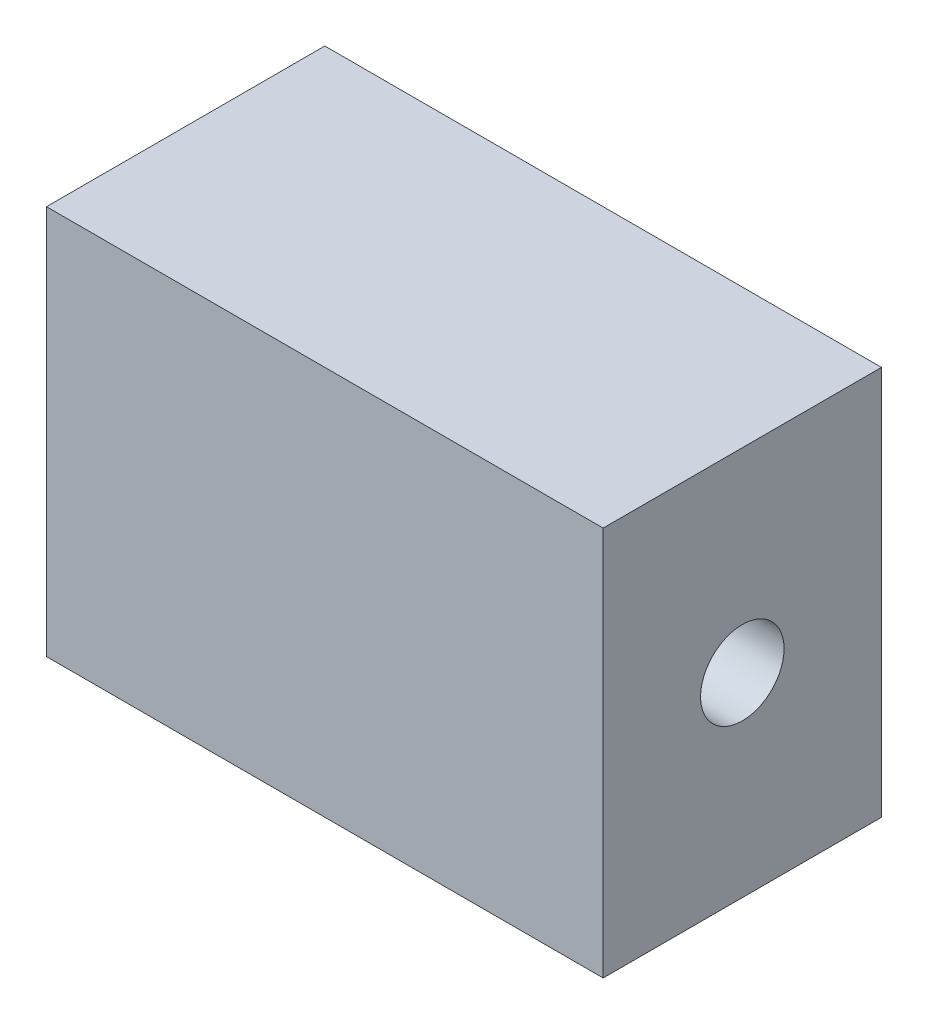
ISO-10303-21;
HEADER;
FILE_DESCRIPTION(('STEP AP214'),'2;1');
FILE_NAME('part.step','',(''),(''),'','','');
FILE_SCHEMA(('AUTOMOTIVE_DESIGN { 1 0 10303 214 1 1 1 1 }'));
ENDSEC;
DATA;
#1=APPLICATION_CONTEXT('core data for automotive mechanical design processes');
#2=APPLICATION_PROTOCOL_DEFINITION('international standard','automotive_design',2000,#1);
#3=PRODUCT_CONTEXT('',#1,'mechanical');
#4=PRODUCT('Part','Part','',(#3));
#5=PRODUCT_RELATED_PRODUCT_CATEGORY('part','',(#4));
#6=PRODUCT_DEFINITION_FORMATION('','',#4);
#7=PRODUCT_DEFINITION_CONTEXT('part definition',#1,'design');
#8=PRODUCT_DEFINITION('design','',#6,#7);
#9=PRODUCT_DEFINITION_SHAPE('','',#8);
#10=(LENGTH_UNIT() NAMED_UNIT(*) SI_UNIT(.MILLI.,.METRE.));
#11=(NAMED_UNIT(*) PLANE_ANGLE_UNIT() SI_UNIT($,.RADIAN.));
#12=(NAMED_UNIT(*) SI_UNIT($,.STERADIAN.) SOLID_ANGLE_UNIT());
#13=UNCERTAINTY_MEASURE_WITH_UNIT(LENGTH_MEASURE(1.E-05),#10,'distance_accuracy_value','');
#14=(GEOMETRIC_REPRESENTATION_CONTEXT(3) GLOBAL_UNCERTAINTY_ASSIGNED_CONTEXT((#13)) GLOBAL_UNIT_ASSIGNED_CONTEXT((#10,
#11,#12)) REPRESENTATION_CONTEXT('',''));
#15=CARTESIAN_POINT('',(0.,0.,0.));
#16=DIRECTION('',(0.,0.,1.));
#17=DIRECTION('',(1.,0.,0.));
#18=AXIS2_PLACEMENT_3D('',#15,#16,#17);
#19=CARTESIAN_POINT('',(100.,0.,50.));
#20=DIRECTION('',(0.,1.,0.));
#21=DIRECTION('',(0.,0.,1.));
#22=AXIS2_PLACEMENT_3D('',#19,#20,#21);
#23=PLANE('',#22);
#24=DIRECTION('',(1.,0.,0.));
#25=VECTOR('',#24,1.);
#26=CARTESIAN_POINT('',(100.,0.,0.));
#27=LINE('',#26,#25);
#28=CARTESIAN_POINT('',(0.,0.,0.));
#29=VERTEX_POINT('',#28);
#30=CARTESIAN_POINT('',(100.,0.,0.));
#31=VERTEX_POINT('',#30);
#32=EDGE_CURVE('E168',#29,#31,#27,.T.);
#33=ORIENTED_EDGE('',*,*,#32,.T.);
#34=DIRECTION('',(0.,0.,-1.));
#35=VECTOR('',#34,1.);
#36=CARTESIAN_POINT('',(100.,0.,50.));
#37=LINE('',#36,#35);
#38=CARTESIAN_POINT('',(100.,0.,50.));
#39=VERTEX_POINT('',#38);
#40=EDGE_CURVE('E11',#39,#31,#37,.T.);
#41=ORIENTED_EDGE('',*,*,#40,.F.);
#42=DIRECTION('',(1.,0.,0.));
#43=VECTOR('',#42,1.);
#44=CARTESIAN_POINT('',(100.,0.,50.));
#45=LINE('',#44,#43);
#46=CARTESIAN_POINT('',(0.,0.,50.));
#47=VERTEX_POINT('',#46);
#48=EDGE_CURVE('E172',#47,#39,#45,.T.);
#49=ORIENTED_EDGE('',*,*,#48,.F.);
#50=DIRECTION('',(0.,0.,-1.));
#51=VECTOR('',#50,1.);
#52=CARTESIAN_POINT('',(0.,0.,50.));
#53=LINE('',#52,#51);
#54=EDGE_CURVE('E182',#47,#29,#53,.T.);
#55=ORIENTED_EDGE('',*,*,#54,.T.);
#56=EDGE_LOOP('',(#33,#41,#49,#55));
#57=FACE_BOUND('',#56,.T.);
#58=ADVANCED_FACE('F39',(#57),#23,.F.);
#59=CARTESIAN_POINT('',(100.,70.,50.));
#60=DIRECTION('',(-1.,0.,0.));
#61=DIRECTION('',(0.,0.,1.));
#62=AXIS2_PLACEMENT_3D('',#59,#60,#61);
#63=PLANE('',#62);
#64=CARTESIAN_POINT('',(100.,35.,25.));
#65=DIRECTION('',(1.,0.,0.));
#66=DIRECTION('',(0.,0.,-1.));
#67=AXIS2_PLACEMENT_3D('',#64,#65,#66);
#68=CIRCLE('',#67,7.5);
#69=CARTESIAN_POINT('',(100.,35.,17.5));
#70=VERTEX_POINT('',#69);
#71=EDGE_CURVE('E158',#70,#70,#68,.T.);
#72=ORIENTED_EDGE('',*,*,#71,.F.);
#73=EDGE_LOOP('',(#72));
#74=FACE_BOUND('',#73,.T.);
#75=DIRECTION('',(0.,1.,0.));
#76=VECTOR('',#75,1.);
#77=CARTESIAN_POINT('',(100.,70.,0.));
#78=LINE('',#77,#76);
#79=CARTESIAN_POINT('',(100.,70.,0.));
#80=VERTEX_POINT('',#79);
#81=EDGE_CURVE('E186',#31,#80,#78,.T.);
#82=ORIENTED_EDGE('',*,*,#81,.T.);
#83=DIRECTION('',(0.,0.,-1.));
#84=VECTOR('',#83,1.);
#85=CARTESIAN_POINT('',(100.,70.,50.));
#86=LINE('',#85,#84);
#87=CARTESIAN_POINT('',(100.,70.,50.));
#88=VERTEX_POINT('',#87);
#89=EDGE_CURVE('E47',#88,#80,#86,.T.);
#90=ORIENTED_EDGE('',*,*,#89,.F.);
#91=DIRECTION('',(0.,1.,0.));
#92=VECTOR('',#91,1.);
#93=CARTESIAN_POINT('',(100.,70.,50.));
#94=LINE('',#93,#92);
#95=EDGE_CURVE('E91',#39,#88,#94,.T.);
#96=ORIENTED_EDGE('',*,*,#95,.F.);
#97=ORIENTED_EDGE('',*,*,#40,.T.);
#98=EDGE_LOOP('',(#82,#90,#96,#97));
#99=FACE_BOUND('',#98,.T.);
#100=ADVANCED_FACE('F221',(#74,#99),#63,.F.);
#101=CARTESIAN_POINT('',(0.,70.,50.));
#102=DIRECTION('',(0.,-1.,0.));
#103=DIRECTION('',(0.,0.,-1.));
#104=AXIS2_PLACEMENT_3D('',#101,#102,#103);
#105=PLANE('',#104);
#106=DIRECTION('',(-1.,0.,0.));
#107=VECTOR('',#106,1.);
#108=CARTESIAN_POINT('',(0.,70.,0.));
#109=LINE('',#108,#107);
#110=CARTESIAN_POINT('',(0.,70.,0.));
#111=VERTEX_POINT('',#110);
#112=EDGE_CURVE('E189',#80,#111,#109,.T.);
#113=ORIENTED_EDGE('',*,*,#112,.T.);
#114=DIRECTION('',(0.,0.,-1.));
#115=VECTOR('',#114,1.);
#116=CARTESIAN_POINT('',(0.,70.,50.));
#117=LINE('',#116,#115);
#118=CARTESIAN_POINT('',(0.,70.,50.));
#119=VERTEX_POINT('',#118);
#120=EDGE_CURVE('E196',#119,#111,#117,.T.);
#121=ORIENTED_EDGE('',*,*,#120,.F.);
#122=DIRECTION('',(-1.,0.,0.));
#123=VECTOR('',#122,1.);
#124=CARTESIAN_POINT('',(0.,70.,50.));
#125=LINE('',#124,#123);
#126=EDGE_CURVE('E177',#88,#119,#125,.T.);
#127=ORIENTED_EDGE('',*,*,#126,.F.);
#128=ORIENTED_EDGE('',*,*,#89,.T.);
#129=EDGE_LOOP('',(#113,#121,#127,#128));
#130=FACE_BOUND('',#129,.T.);
#131=ADVANCED_FACE('F203',(#130),#105,.F.);
#132=CARTESIAN_POINT('',(0.,0.,50.));
#133=DIRECTION('',(1.,0.,0.));
#134=DIRECTION('',(0.,0.,-1.));
#135=AXIS2_PLACEMENT_3D('',#132,#133,#134);
#136=PLANE('',#135);
#137=CARTESIAN_POINT('',(0.,35.,25.));
#138=DIRECTION('',(1.,0.,0.));
#139=DIRECTION('',(0.,0.,-1.));
#140=AXIS2_PLACEMENT_3D('',#137,#138,#139);
#141=CIRCLE('',#140,7.5);
#142=CARTESIAN_POINT('',(0.,35.,17.5));
#143=VERTEX_POINT('',#142);
#144=EDGE_CURVE('E164',#143,#143,#141,.T.);
#145=ORIENTED_EDGE('',*,*,#144,.T.);
#146=EDGE_LOOP('',(#145));
#147=FACE_BOUND('',#146,.T.);
#148=DIRECTION('',(0.,-1.,0.));
#149=VECTOR('',#148,1.);
#150=CARTESIAN_POINT('',(0.,0.,0.));
#151=LINE('',#150,#149);
#152=EDGE_CURVE('E84',#111,#29,#151,.T.);
#153=ORIENTED_EDGE('',*,*,#152,.T.);
#154=ORIENTED_EDGE('',*,*,#54,.F.);
#155=DIRECTION('',(0.,-1.,0.));
#156=VECTOR('',#155,1.);
#157=CARTESIAN_POINT('',(0.,0.,50.));
#158=LINE('',#157,#156);
#159=EDGE_CURVE('E63',#119,#47,#158,.T.);
#160=ORIENTED_EDGE('',*,*,#159,.F.);
#161=ORIENTED_EDGE('',*,*,#120,.T.);
#162=EDGE_LOOP('',(#153,#154,#160,#161));
#163=FACE_BOUND('',#162,.T.);
#164=ADVANCED_FACE('F211',(#147,#163),#136,.F.);
#165=CARTESIAN_POINT('',(0.,0.,50.));
#166=DIRECTION('',(0.,0.,-1.));
#167=DIRECTION('',(-1.,0.,0.));
#168=AXIS2_PLACEMENT_3D('',#165,#166,#167);
#169=PLANE('',#168);
#170=ORIENTED_EDGE('',*,*,#48,.T.);
#171=ORIENTED_EDGE('',*,*,#95,.T.);
#172=ORIENTED_EDGE('',*,*,#126,.T.);
#173=ORIENTED_EDGE('',*,*,#159,.T.);
#174=EDGE_LOOP('',(#170,#171,#172,#173));
#175=FACE_BOUND('',#174,.T.);
#176=ADVANCED_FACE('F213',(#175),#169,.F.);
#177=CARTESIAN_POINT('',(0.,0.,0.));
#178=DIRECTION('',(0.,0.,-1.));
#179=DIRECTION('',(-1.,0.,0.));
#180=AXIS2_PLACEMENT_3D('',#177,#178,#179);
#181=PLANE('',#180);
#182=DIRECTION('',(1.,0.,0.));
#183=VECTOR('',#182,1.);
#184=CARTESIAN_POINT('',(10.,60.,0.));
#185=LINE('',#184,#183);
#186=CARTESIAN_POINT('',(10.,60.,0.));
#187=VERTEX_POINT('',#186);
#188=CARTESIAN_POINT('',(90.,60.,0.));
#189=VERTEX_POINT('',#188);
#190=EDGE_CURVE('E54',#187,#189,#185,.T.);
#191=ORIENTED_EDGE('',*,*,#190,.F.);
#192=DIRECTION('',(0.,1.,0.));
#193=VECTOR('',#192,1.);
#194=CARTESIAN_POINT('',(9.99999999999999,10.,0.));
#195=LINE('',#194,#193);
#196=CARTESIAN_POINT('',(9.99999999999999,10.,0.));
#197=VERTEX_POINT('',#196);
#198=EDGE_CURVE('E136',#197,#187,#195,.T.);
#199=ORIENTED_EDGE('',*,*,#198,.F.);
#200=DIRECTION('',(-1.,0.,0.));
#201=VECTOR('',#200,1.);
#202=CARTESIAN_POINT('',(90.,10.,0.));
#203=LINE('',#202,#201);
#204=CARTESIAN_POINT('',(90.,10.,0.));
#205=VERTEX_POINT('',#204);
#206=EDGE_CURVE('E140',#205,#197,#203,.T.);
#207=ORIENTED_EDGE('',*,*,#206,.F.);
#208=DIRECTION('',(0.,-1.,0.));
#209=VECTOR('',#208,1.);
#210=CARTESIAN_POINT('',(90.,60.,0.));
#211=LINE('',#210,#209);
#212=EDGE_CURVE('E149',#189,#205,#211,.T.);
#213=ORIENTED_EDGE('',*,*,#212,.F.);
#214=EDGE_LOOP('',(#191,#199,#207,#213));
#215=FACE_BOUND('',#214,.T.);
#216=ORIENTED_EDGE('',*,*,#32,.F.);
#217=ORIENTED_EDGE('',*,*,#152,.F.);
#218=ORIENTED_EDGE('',*,*,#112,.F.);
#219=ORIENTED_EDGE('',*,*,#81,.F.);
#220=EDGE_LOOP('',(#216,#217,#218,#219));
#221=FACE_BOUND('',#220,.T.);
#222=ADVANCED_FACE('F207',(#215,#221),#181,.T.);
#223=CARTESIAN_POINT('',(0.,35.,25.));
#224=DIRECTION('',(1.,0.,0.));
#225=DIRECTION('',(0.,0.,-1.));
#226=AXIS2_PLACEMENT_3D('',#223,#224,#225);
#227=CYLINDRICAL_SURFACE('',#226,7.5);
#228=ORIENTED_EDGE('',*,*,#144,.F.);
#229=EDGE_LOOP('',(#228));
#230=FACE_BOUND('',#229,.T.);
#231=ORIENTED_EDGE('',*,*,#71,.T.);
#232=EDGE_LOOP('',(#231));
#233=FACE_BOUND('',#232,.T.);
#234=ADVANCED_FACE('F233',(#230,#233),#227,.F.);
#235=CARTESIAN_POINT('',(10.,60.,10.));
#236=DIRECTION('',(0.,1.,0.));
#237=DIRECTION('',(-1.,0.,0.));
#238=AXIS2_PLACEMENT_3D('',#235,#236,#237);
#239=PLANE('',#238);
#240=ORIENTED_EDGE('',*,*,#190,.T.);
#241=DIRECTION('',(0.,0.,-1.));
#242=VECTOR('',#241,1.);
#243=CARTESIAN_POINT('',(90.,60.,10.));
#244=LINE('',#243,#242);
#245=CARTESIAN_POINT('',(90.,60.,10.));
#246=VERTEX_POINT('',#245);
#247=EDGE_CURVE('E111',#246,#189,#244,.T.);
#248=ORIENTED_EDGE('',*,*,#247,.F.);
#249=DIRECTION('',(1.,0.,0.));
#250=VECTOR('',#249,1.);
#251=CARTESIAN_POINT('',(10.,60.,10.));
#252=LINE('',#251,#250);
#253=CARTESIAN_POINT('',(10.,60.,10.));
#254=VERTEX_POINT('',#253);
#255=EDGE_CURVE('E115',#254,#246,#252,.T.);
#256=ORIENTED_EDGE('',*,*,#255,.F.);
#257=DIRECTION('',(0.,0.,-1.));
#258=VECTOR('',#257,1.);
#259=CARTESIAN_POINT('',(10.,60.,10.));
#260=LINE('',#259,#258);
#261=EDGE_CURVE('E155',#254,#187,#260,.T.);
#262=ORIENTED_EDGE('',*,*,#261,.T.);
#263=EDGE_LOOP('',(#240,#248,#256,#262));
#264=FACE_BOUND('',#263,.T.);
#265=ADVANCED_FACE('F113',(#264),#239,.F.);
#266=CARTESIAN_POINT('',(9.99999999999999,10.,10.));
#267=DIRECTION('',(-1.,0.,0.));
#268=DIRECTION('',(0.,-1.,0.));
#269=AXIS2_PLACEMENT_3D('',#266,#267,#268);
#270=PLANE('',#269);
#271=ORIENTED_EDGE('',*,*,#198,.T.);
#272=ORIENTED_EDGE('',*,*,#261,.F.);
#273=DIRECTION('',(0.,1.,0.));
#274=VECTOR('',#273,1.);
#275=CARTESIAN_POINT('',(9.99999999999999,10.,10.));
#276=LINE('',#275,#274);
#277=CARTESIAN_POINT('',(9.99999999999999,10.,10.));
#278=VERTEX_POINT('',#277);
#279=EDGE_CURVE('E122',#278,#254,#276,.T.);
#280=ORIENTED_EDGE('',*,*,#279,.F.);
#281=DIRECTION('',(0.,0.,-1.));
#282=VECTOR('',#281,1.);
#283=CARTESIAN_POINT('',(9.99999999999999,10.,10.));
#284=LINE('',#283,#282);
#285=EDGE_CURVE('E159',#278,#197,#284,.T.);
#286=ORIENTED_EDGE('',*,*,#285,.T.);
#287=EDGE_LOOP('',(#271,#272,#280,#286));
#288=FACE_BOUND('',#287,.T.);
#289=ADVANCED_FACE('F241',(#288),#270,.F.);
#290=CARTESIAN_POINT('',(90.,10.,10.));
#291=DIRECTION('',(0.,-1.,0.));
#292=DIRECTION('',(1.,0.,0.));
#293=AXIS2_PLACEMENT_3D('',#290,#291,#292);
#294=PLANE('',#293);
#295=ORIENTED_EDGE('',*,*,#206,.T.);
#296=ORIENTED_EDGE('',*,*,#285,.F.);
#297=DIRECTION('',(-1.,0.,0.));
#298=VECTOR('',#297,1.);
#299=CARTESIAN_POINT('',(90.,10.,10.));
#300=LINE('',#299,#298);
#301=CARTESIAN_POINT('',(90.,10.,10.));
#302=VERTEX_POINT('',#301);
#303=EDGE_CURVE('E131',#302,#278,#300,.T.);
#304=ORIENTED_EDGE('',*,*,#303,.F.);
#305=DIRECTION('',(0.,0.,-1.));
#306=VECTOR('',#305,1.);
#307=CARTESIAN_POINT('',(90.,10.,10.));
#308=LINE('',#307,#306);
#309=EDGE_CURVE('E121',#302,#205,#308,.T.);
#310=ORIENTED_EDGE('',*,*,#309,.T.);
#311=EDGE_LOOP('',(#295,#296,#304,#310));
#312=FACE_BOUND('',#311,.T.);
#313=ADVANCED_FACE('F248',(#312),#294,.F.);
#314=CARTESIAN_POINT('',(90.,60.,10.));
#315=DIRECTION('',(1.,0.,0.));
#316=DIRECTION('',(0.,0.,-1.));
#317=AXIS2_PLACEMENT_3D('',#314,#315,#316);
#318=PLANE('',#317);
#319=ORIENTED_EDGE('',*,*,#212,.T.);
#320=ORIENTED_EDGE('',*,*,#309,.F.);
#321=DIRECTION('',(0.,-1.,0.));
#322=VECTOR('',#321,1.);
#323=CARTESIAN_POINT('',(90.,60.,10.));
#324=LINE('',#323,#322);
#325=EDGE_CURVE('E125',#246,#302,#324,.T.);
#326=ORIENTED_EDGE('',*,*,#325,.F.);
#327=ORIENTED_EDGE('',*,*,#247,.T.);
#328=EDGE_LOOP('',(#319,#320,#326,#327));
#329=FACE_BOUND('',#328,.T.);
#330=ADVANCED_FACE('F126',(#329),#318,.F.);
#331=CARTESIAN_POINT('',(0.,0.,10.));
#332=DIRECTION('',(0.,0.,-1.));
#333=DIRECTION('',(-1.,0.,0.));
#334=AXIS2_PLACEMENT_3D('',#331,#332,#333);
#335=PLANE('',#334);
#336=ORIENTED_EDGE('',*,*,#255,.T.);
#337=ORIENTED_EDGE('',*,*,#325,.T.);
#338=ORIENTED_EDGE('',*,*,#303,.T.);
#339=ORIENTED_EDGE('',*,*,#279,.T.);
#340=EDGE_LOOP('',(#336,#337,#338,#339));
#341=FACE_BOUND('',#340,.T.);
#342=ADVANCED_FACE('F133',(#341),#335,.T.);
#343=CLOSED_SHELL('',(#58,#100,#131,#164,#176,#222,#234,#265,#289,#313,#330,#342));
#344=MANIFOLD_SOLID_BREP('B2',#343);
#345=ADVANCED_BREP_SHAPE_REPRESENTATION('',(#18,#344),#14);
#346=SHAPE_DEFINITION_REPRESENTATION(#9,#345);
ENDSEC;
END-ISO-10303-21;
